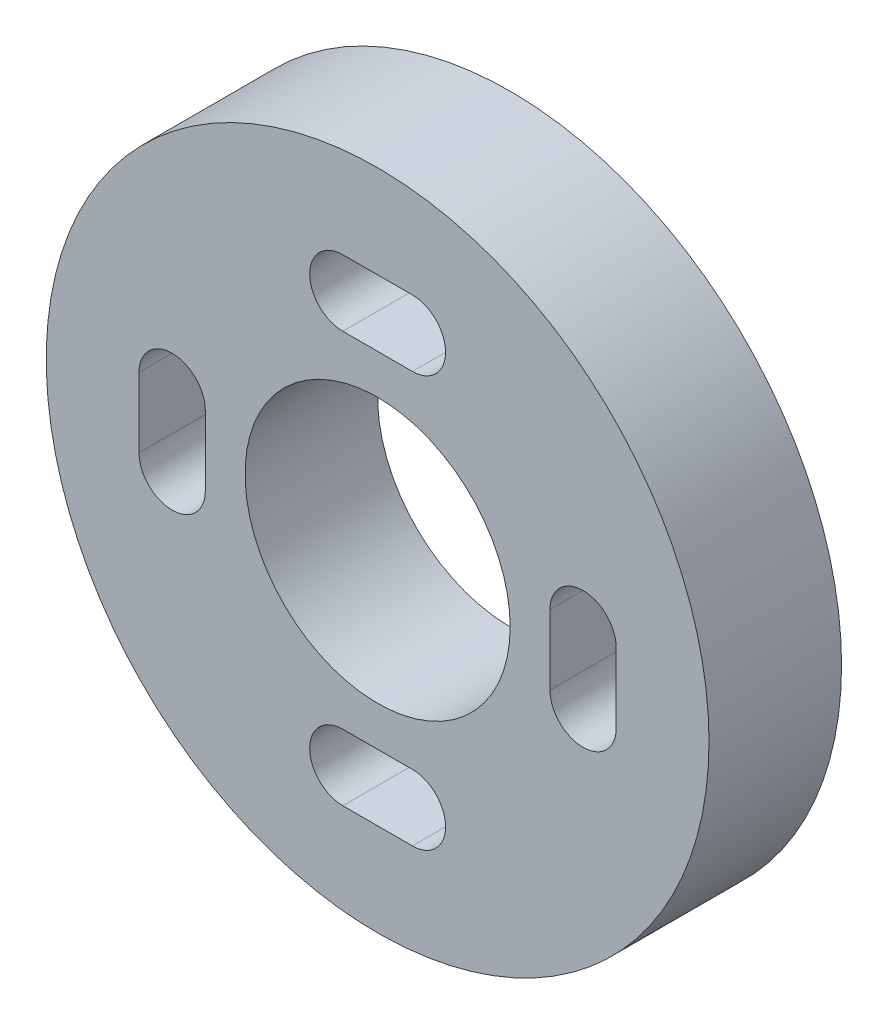
ISO-10303-21;
HEADER;
FILE_DESCRIPTION(('STEP AP214'),'2;1');
FILE_NAME('part.step','',(''),(''),'','','');
FILE_SCHEMA(('AUTOMOTIVE_DESIGN { 1 0 10303 214 1 1 1 1 }'));
ENDSEC;
DATA;
#1=APPLICATION_CONTEXT('core data for automotive mechanical design processes');
#2=APPLICATION_PROTOCOL_DEFINITION('international standard','automotive_design',2000,#1);
#3=PRODUCT_CONTEXT('',#1,'mechanical');
#4=PRODUCT('Part','Part','',(#3));
#5=PRODUCT_RELATED_PRODUCT_CATEGORY('part','',(#4));
#6=PRODUCT_DEFINITION_FORMATION('','',#4);
#7=PRODUCT_DEFINITION_CONTEXT('part definition',#1,'design');
#8=PRODUCT_DEFINITION('design','',#6,#7);
#9=PRODUCT_DEFINITION_SHAPE('','',#8);
#10=(LENGTH_UNIT() NAMED_UNIT(*) SI_UNIT(.MILLI.,.METRE.));
#11=(NAMED_UNIT(*) PLANE_ANGLE_UNIT() SI_UNIT($,.RADIAN.));
#12=(NAMED_UNIT(*) SI_UNIT($,.STERADIAN.) SOLID_ANGLE_UNIT());
#13=UNCERTAINTY_MEASURE_WITH_UNIT(LENGTH_MEASURE(1.E-05),#10,'distance_accuracy_value','');
#14=(GEOMETRIC_REPRESENTATION_CONTEXT(3) GLOBAL_UNCERTAINTY_ASSIGNED_CONTEXT((#13)) GLOBAL_UNIT_ASSIGNED_CONTEXT((#10,
#11,#12)) REPRESENTATION_CONTEXT('',''));
#15=CARTESIAN_POINT('',(0.,0.,0.));
#16=DIRECTION('',(0.,0.,1.));
#17=DIRECTION('',(1.,0.,0.));
#18=AXIS2_PLACEMENT_3D('',#15,#16,#17);
#19=CARTESIAN_POINT('',(0.,0.,4.));
#20=DIRECTION('',(0.,0.,-1.));
#21=DIRECTION('',(-1.,0.,0.));
#22=AXIS2_PLACEMENT_3D('',#19,#20,#21);
#23=CYLINDRICAL_SURFACE('',#22,10.);
#24=CARTESIAN_POINT('',(0.,0.,4.));
#25=DIRECTION('',(0.,0.,1.));
#26=DIRECTION('',(1.,0.,0.));
#27=AXIS2_PLACEMENT_3D('',#24,#25,#26);
#28=CIRCLE('',#27,10.);
#29=CARTESIAN_POINT('',(10.,0.,4.));
#30=VERTEX_POINT('',#29);
#31=EDGE_CURVE('E11',#30,#30,#28,.T.);
#32=ORIENTED_EDGE('',*,*,#31,.F.);
#33=EDGE_LOOP('',(#32));
#34=FACE_BOUND('',#33,.T.);
#35=CARTESIAN_POINT('',(0.,0.,0.));
#36=DIRECTION('',(0.,0.,1.));
#37=DIRECTION('',(1.,0.,0.));
#38=AXIS2_PLACEMENT_3D('',#35,#36,#37);
#39=CIRCLE('',#38,10.);
#40=CARTESIAN_POINT('',(10.,0.,0.));
#41=VERTEX_POINT('',#40);
#42=EDGE_CURVE('E41',#41,#41,#39,.T.);
#43=ORIENTED_EDGE('',*,*,#42,.T.);
#44=EDGE_LOOP('',(#43));
#45=FACE_BOUND('',#44,.T.);
#46=ADVANCED_FACE('F38',(#34,#45),#23,.T.);
#47=CARTESIAN_POINT('',(0.,0.,4.));
#48=DIRECTION('',(0.,0.,1.));
#49=DIRECTION('',(1.,0.,0.));
#50=AXIS2_PLACEMENT_3D('',#47,#48,#49);
#51=PLANE('',#50);
#52=DIRECTION('',(1.,0.,0.));
#53=VECTOR('',#52,1.);
#54=CARTESIAN_POINT('',(-1.05,5.2,4.));
#55=LINE('',#54,#53);
#56=CARTESIAN_POINT('',(-1.05,5.2,4.));
#57=VERTEX_POINT('',#56);
#58=CARTESIAN_POINT('',(1.05,5.2,4.));
#59=VERTEX_POINT('',#58);
#60=EDGE_CURVE('E253',#57,#59,#55,.T.);
#61=ORIENTED_EDGE('',*,*,#60,.F.);
#62=CARTESIAN_POINT('',(-1.05,6.2,4.));
#63=DIRECTION('',(0.,0.,1.));
#64=DIRECTION('',(1.,0.,0.));
#65=AXIS2_PLACEMENT_3D('',#62,#63,#64);
#66=CIRCLE('',#65,1.);
#67=CARTESIAN_POINT('',(-1.05,7.2,4.));
#68=VERTEX_POINT('',#67);
#69=EDGE_CURVE('E250',#68,#57,#66,.T.);
#70=ORIENTED_EDGE('',*,*,#69,.F.);
#71=DIRECTION('',(-1.,0.,0.));
#72=VECTOR('',#71,1.);
#73=CARTESIAN_POINT('',(-1.05,7.2,4.));
#74=LINE('',#73,#72);
#75=CARTESIAN_POINT('',(1.05,7.2,4.));
#76=VERTEX_POINT('',#75);
#77=EDGE_CURVE('E260',#76,#68,#74,.T.);
#78=ORIENTED_EDGE('',*,*,#77,.F.);
#79=CARTESIAN_POINT('',(1.05,6.2,4.));
#80=DIRECTION('',(0.,0.,1.));
#81=DIRECTION('',(1.,0.,0.));
#82=AXIS2_PLACEMENT_3D('',#79,#80,#81);
#83=CIRCLE('',#82,1.);
#84=EDGE_CURVE('E257',#59,#76,#83,.T.);
#85=ORIENTED_EDGE('',*,*,#84,.F.);
#86=EDGE_LOOP('',(#61,#70,#78,#85));
#87=FACE_BOUND('',#86,.T.);
#88=DIRECTION('',(0.,-1.,0.));
#89=VECTOR('',#88,1.);
#90=CARTESIAN_POINT('',(-7.2,1.05,4.));
#91=LINE('',#90,#89);
#92=CARTESIAN_POINT('',(-7.2,1.05,4.));
#93=VERTEX_POINT('',#92);
#94=CARTESIAN_POINT('',(-7.2,-1.05,4.));
#95=VERTEX_POINT('',#94);
#96=EDGE_CURVE('E296',#93,#95,#91,.T.);
#97=ORIENTED_EDGE('',*,*,#96,.F.);
#98=CARTESIAN_POINT('',(-6.2,1.05,4.));
#99=DIRECTION('',(0.,0.,1.));
#100=DIRECTION('',(1.,0.,0.));
#101=AXIS2_PLACEMENT_3D('',#98,#99,#100);
#102=CIRCLE('',#101,1.);
#103=CARTESIAN_POINT('',(-5.2,1.05,4.));
#104=VERTEX_POINT('',#103);
#105=EDGE_CURVE('E293',#104,#93,#102,.T.);
#106=ORIENTED_EDGE('',*,*,#105,.F.);
#107=DIRECTION('',(0.,1.,0.));
#108=VECTOR('',#107,1.);
#109=CARTESIAN_POINT('',(-5.2,1.05,4.));
#110=LINE('',#109,#108);
#111=CARTESIAN_POINT('',(-5.2,-1.05,4.));
#112=VERTEX_POINT('',#111);
#113=EDGE_CURVE('E303',#112,#104,#110,.T.);
#114=ORIENTED_EDGE('',*,*,#113,.F.);
#115=CARTESIAN_POINT('',(-6.2,-1.05,4.));
#116=DIRECTION('',(0.,0.,1.));
#117=DIRECTION('',(1.,0.,0.));
#118=AXIS2_PLACEMENT_3D('',#115,#116,#117);
#119=CIRCLE('',#118,1.);
#120=EDGE_CURVE('E300',#95,#112,#119,.T.);
#121=ORIENTED_EDGE('',*,*,#120,.F.);
#122=EDGE_LOOP('',(#97,#106,#114,#121));
#123=FACE_BOUND('',#122,.T.);
#124=DIRECTION('',(0.,-1.,0.));
#125=VECTOR('',#124,1.);
#126=CARTESIAN_POINT('',(5.2,1.05,4.));
#127=LINE('',#126,#125);
#128=CARTESIAN_POINT('',(5.2,1.05,4.));
#129=VERTEX_POINT('',#128);
#130=CARTESIAN_POINT('',(5.2,-1.05,4.));
#131=VERTEX_POINT('',#130);
#132=EDGE_CURVE('E163',#129,#131,#127,.T.);
#133=ORIENTED_EDGE('',*,*,#132,.F.);
#134=CARTESIAN_POINT('',(6.2,1.05,4.));
#135=DIRECTION('',(0.,0.,1.));
#136=DIRECTION('',(-1.,0.,0.));
#137=AXIS2_PLACEMENT_3D('',#134,#135,#136);
#138=CIRCLE('',#137,1.);
#139=CARTESIAN_POINT('',(7.2,1.05,4.));
#140=VERTEX_POINT('',#139);
#141=EDGE_CURVE('E152',#140,#129,#138,.T.);
#142=ORIENTED_EDGE('',*,*,#141,.F.);
#143=DIRECTION('',(0.,1.,0.));
#144=VECTOR('',#143,1.);
#145=CARTESIAN_POINT('',(7.2,1.05,4.));
#146=LINE('',#145,#144);
#147=CARTESIAN_POINT('',(7.2,-1.05,4.));
#148=VERTEX_POINT('',#147);
#149=EDGE_CURVE('E183',#148,#140,#146,.T.);
#150=ORIENTED_EDGE('',*,*,#149,.F.);
#151=CARTESIAN_POINT('',(6.2,-1.05,4.));
#152=DIRECTION('',(0.,0.,1.));
#153=DIRECTION('',(-1.,0.,0.));
#154=AXIS2_PLACEMENT_3D('',#151,#152,#153);
#155=CIRCLE('',#154,1.);
#156=EDGE_CURVE('E179',#131,#148,#155,.T.);
#157=ORIENTED_EDGE('',*,*,#156,.F.);
#158=EDGE_LOOP('',(#133,#142,#150,#157));
#159=FACE_BOUND('',#158,.T.);
#160=DIRECTION('',(1.,0.,0.));
#161=VECTOR('',#160,1.);
#162=CARTESIAN_POINT('',(-1.05,-7.2,4.));
#163=LINE('',#162,#161);
#164=CARTESIAN_POINT('',(-1.05,-7.2,4.));
#165=VERTEX_POINT('',#164);
#166=CARTESIAN_POINT('',(1.05,-7.2,4.));
#167=VERTEX_POINT('',#166);
#168=EDGE_CURVE('E211',#165,#167,#163,.T.);
#169=ORIENTED_EDGE('',*,*,#168,.F.);
#170=CARTESIAN_POINT('',(-1.05,-6.2,4.));
#171=DIRECTION('',(0.,0.,1.));
#172=DIRECTION('',(-1.,0.,0.));
#173=AXIS2_PLACEMENT_3D('',#170,#171,#172);
#174=CIRCLE('',#173,1.);
#175=CARTESIAN_POINT('',(-1.05,-5.2,4.));
#176=VERTEX_POINT('',#175);
#177=EDGE_CURVE('E208',#176,#165,#174,.T.);
#178=ORIENTED_EDGE('',*,*,#177,.F.);
#179=DIRECTION('',(-1.,0.,0.));
#180=VECTOR('',#179,1.);
#181=CARTESIAN_POINT('',(-1.05,-5.2,4.));
#182=LINE('',#181,#180);
#183=CARTESIAN_POINT('',(1.05,-5.2,4.));
#184=VERTEX_POINT('',#183);
#185=EDGE_CURVE('E219',#184,#176,#182,.T.);
#186=ORIENTED_EDGE('',*,*,#185,.F.);
#187=CARTESIAN_POINT('',(1.05,-6.2,4.));
#188=DIRECTION('',(0.,0.,1.));
#189=DIRECTION('',(-1.,0.,0.));
#190=AXIS2_PLACEMENT_3D('',#187,#188,#189);
#191=CIRCLE('',#190,1.);
#192=EDGE_CURVE('E215',#167,#184,#191,.T.);
#193=ORIENTED_EDGE('',*,*,#192,.F.);
#194=EDGE_LOOP('',(#169,#178,#186,#193));
#195=FACE_BOUND('',#194,.T.);
#196=CARTESIAN_POINT('',(0.,0.,4.));
#197=DIRECTION('',(0.,0.,1.));
#198=DIRECTION('',(1.,0.,0.));
#199=AXIS2_PLACEMENT_3D('',#196,#197,#198);
#200=CIRCLE('',#199,4.);
#201=CARTESIAN_POINT('',(4.,0.,4.));
#202=VERTEX_POINT('',#201);
#203=EDGE_CURVE('E332',#202,#202,#200,.T.);
#204=ORIENTED_EDGE('',*,*,#203,.F.);
#205=EDGE_LOOP('',(#204));
#206=FACE_BOUND('',#205,.T.);
#207=ORIENTED_EDGE('',*,*,#31,.T.);
#208=EDGE_LOOP('',(#207));
#209=FACE_BOUND('',#208,.T.);
#210=ADVANCED_FACE('F176',(#87,#123,#159,#195,#206,#209),#51,.T.);
#211=CARTESIAN_POINT('',(0.,0.,0.));
#212=DIRECTION('',(0.,0.,1.));
#213=DIRECTION('',(1.,0.,0.));
#214=AXIS2_PLACEMENT_3D('',#211,#212,#213);
#215=PLANE('',#214);
#216=CARTESIAN_POINT('',(-1.05,6.2,0.));
#217=DIRECTION('',(0.,0.,1.));
#218=DIRECTION('',(1.,0.,0.));
#219=AXIS2_PLACEMENT_3D('',#216,#217,#218);
#220=CIRCLE('',#219,1.);
#221=CARTESIAN_POINT('',(-1.05,7.2,0.));
#222=VERTEX_POINT('',#221);
#223=CARTESIAN_POINT('',(-1.05,5.2,0.));
#224=VERTEX_POINT('',#223);
#225=EDGE_CURVE('E264',#222,#224,#220,.T.);
#226=ORIENTED_EDGE('',*,*,#225,.T.);
#227=DIRECTION('',(1.,0.,0.));
#228=VECTOR('',#227,1.);
#229=CARTESIAN_POINT('',(-1.05,5.2,0.));
#230=LINE('',#229,#228);
#231=CARTESIAN_POINT('',(1.05,5.2,0.));
#232=VERTEX_POINT('',#231);
#233=EDGE_CURVE('E268',#224,#232,#230,.T.);
#234=ORIENTED_EDGE('',*,*,#233,.T.);
#235=CARTESIAN_POINT('',(1.05,6.2,0.));
#236=DIRECTION('',(0.,0.,1.));
#237=DIRECTION('',(1.,0.,0.));
#238=AXIS2_PLACEMENT_3D('',#235,#236,#237);
#239=CIRCLE('',#238,1.);
#240=CARTESIAN_POINT('',(1.05,7.2,0.));
#241=VERTEX_POINT('',#240);
#242=EDGE_CURVE('E273',#232,#241,#239,.T.);
#243=ORIENTED_EDGE('',*,*,#242,.T.);
#244=DIRECTION('',(-1.,0.,0.));
#245=VECTOR('',#244,1.);
#246=CARTESIAN_POINT('',(-1.05,7.2,0.));
#247=LINE('',#246,#245);
#248=EDGE_CURVE('E254',#241,#222,#247,.T.);
#249=ORIENTED_EDGE('',*,*,#248,.T.);
#250=EDGE_LOOP('',(#226,#234,#243,#249));
#251=FACE_BOUND('',#250,.T.);
#252=CARTESIAN_POINT('',(-6.2,1.05,0.));
#253=DIRECTION('',(0.,0.,1.));
#254=DIRECTION('',(1.,0.,0.));
#255=AXIS2_PLACEMENT_3D('',#252,#253,#254);
#256=CIRCLE('',#255,1.);
#257=CARTESIAN_POINT('',(-5.2,1.05,0.));
#258=VERTEX_POINT('',#257);
#259=CARTESIAN_POINT('',(-7.2,1.05,0.));
#260=VERTEX_POINT('',#259);
#261=EDGE_CURVE('E172',#258,#260,#256,.T.);
#262=ORIENTED_EDGE('',*,*,#261,.T.);
#263=DIRECTION('',(0.,-1.,0.));
#264=VECTOR('',#263,1.);
#265=CARTESIAN_POINT('',(-7.2,1.05,0.));
#266=LINE('',#265,#264);
#267=CARTESIAN_POINT('',(-7.2,-1.05,0.));
#268=VERTEX_POINT('',#267);
#269=EDGE_CURVE('E310',#260,#268,#266,.T.);
#270=ORIENTED_EDGE('',*,*,#269,.T.);
#271=CARTESIAN_POINT('',(-6.2,-1.05,0.));
#272=DIRECTION('',(0.,0.,1.));
#273=DIRECTION('',(1.,0.,0.));
#274=AXIS2_PLACEMENT_3D('',#271,#272,#273);
#275=CIRCLE('',#274,1.);
#276=CARTESIAN_POINT('',(-5.2,-1.05,0.));
#277=VERTEX_POINT('',#276);
#278=EDGE_CURVE('E314',#268,#277,#275,.T.);
#279=ORIENTED_EDGE('',*,*,#278,.T.);
#280=DIRECTION('',(0.,1.,0.));
#281=VECTOR('',#280,1.);
#282=CARTESIAN_POINT('',(-5.2,1.05,0.));
#283=LINE('',#282,#281);
#284=EDGE_CURVE('E297',#277,#258,#283,.T.);
#285=ORIENTED_EDGE('',*,*,#284,.T.);
#286=EDGE_LOOP('',(#262,#270,#279,#285));
#287=FACE_BOUND('',#286,.T.);
#288=CARTESIAN_POINT('',(6.2,1.05,0.));
#289=DIRECTION('',(0.,0.,1.));
#290=DIRECTION('',(-1.,0.,0.));
#291=AXIS2_PLACEMENT_3D('',#288,#289,#290);
#292=CIRCLE('',#291,1.);
#293=CARTESIAN_POINT('',(7.2,1.05,0.));
#294=VERTEX_POINT('',#293);
#295=CARTESIAN_POINT('',(5.2,1.05,0.));
#296=VERTEX_POINT('',#295);
#297=EDGE_CURVE('E188',#294,#296,#292,.T.);
#298=ORIENTED_EDGE('',*,*,#297,.T.);
#299=DIRECTION('',(0.,-1.,0.));
#300=VECTOR('',#299,1.);
#301=CARTESIAN_POINT('',(5.2,1.05,0.));
#302=LINE('',#301,#300);
#303=CARTESIAN_POINT('',(5.2,-1.05,0.));
#304=VERTEX_POINT('',#303);
#305=EDGE_CURVE('E170',#296,#304,#302,.T.);
#306=ORIENTED_EDGE('',*,*,#305,.T.);
#307=CARTESIAN_POINT('',(6.2,-1.05,0.));
#308=DIRECTION('',(0.,0.,1.));
#309=DIRECTION('',(-1.,0.,0.));
#310=AXIS2_PLACEMENT_3D('',#307,#308,#309);
#311=CIRCLE('',#310,1.);
#312=CARTESIAN_POINT('',(7.2,-1.05,0.));
#313=VERTEX_POINT('',#312);
#314=EDGE_CURVE('E194',#304,#313,#311,.T.);
#315=ORIENTED_EDGE('',*,*,#314,.T.);
#316=DIRECTION('',(0.,1.,0.));
#317=VECTOR('',#316,1.);
#318=CARTESIAN_POINT('',(7.2,1.05,0.));
#319=LINE('',#318,#317);
#320=EDGE_CURVE('E164',#313,#294,#319,.T.);
#321=ORIENTED_EDGE('',*,*,#320,.T.);
#322=EDGE_LOOP('',(#298,#306,#315,#321));
#323=FACE_BOUND('',#322,.T.);
#324=CARTESIAN_POINT('',(-1.05,-6.2,0.));
#325=DIRECTION('',(0.,0.,1.));
#326=DIRECTION('',(-1.,0.,0.));
#327=AXIS2_PLACEMENT_3D('',#324,#325,#326);
#328=CIRCLE('',#327,1.);
#329=CARTESIAN_POINT('',(-1.05,-5.2,0.));
#330=VERTEX_POINT('',#329);
#331=CARTESIAN_POINT('',(-1.05,-7.2,0.));
#332=VERTEX_POINT('',#331);
#333=EDGE_CURVE('E223',#330,#332,#328,.T.);
#334=ORIENTED_EDGE('',*,*,#333,.T.);
#335=DIRECTION('',(1.,0.,0.));
#336=VECTOR('',#335,1.);
#337=CARTESIAN_POINT('',(-1.05,-7.2,0.));
#338=LINE('',#337,#336);
#339=CARTESIAN_POINT('',(1.05,-7.2,0.));
#340=VERTEX_POINT('',#339);
#341=EDGE_CURVE('E227',#332,#340,#338,.T.);
#342=ORIENTED_EDGE('',*,*,#341,.T.);
#343=CARTESIAN_POINT('',(1.05,-6.2,0.));
#344=DIRECTION('',(0.,0.,1.));
#345=DIRECTION('',(-1.,0.,0.));
#346=AXIS2_PLACEMENT_3D('',#343,#344,#345);
#347=CIRCLE('',#346,1.);
#348=CARTESIAN_POINT('',(1.05,-5.2,0.));
#349=VERTEX_POINT('',#348);
#350=EDGE_CURVE('E231',#340,#349,#347,.T.);
#351=ORIENTED_EDGE('',*,*,#350,.T.);
#352=DIRECTION('',(-1.,0.,0.));
#353=VECTOR('',#352,1.);
#354=CARTESIAN_POINT('',(-1.05,-5.2,0.));
#355=LINE('',#354,#353);
#356=EDGE_CURVE('E212',#349,#330,#355,.T.);
#357=ORIENTED_EDGE('',*,*,#356,.T.);
#358=EDGE_LOOP('',(#334,#342,#351,#357));
#359=FACE_BOUND('',#358,.T.);
#360=CARTESIAN_POINT('',(0.,0.,0.));
#361=DIRECTION('',(0.,0.,1.));
#362=DIRECTION('',(1.,0.,0.));
#363=AXIS2_PLACEMENT_3D('',#360,#361,#362);
#364=CIRCLE('',#363,4.);
#365=CARTESIAN_POINT('',(4.,0.,0.));
#366=VERTEX_POINT('',#365);
#367=EDGE_CURVE('E292',#366,#366,#364,.T.);
#368=ORIENTED_EDGE('',*,*,#367,.T.);
#369=EDGE_LOOP('',(#368));
#370=FACE_BOUND('',#369,.T.);
#371=ORIENTED_EDGE('',*,*,#42,.F.);
#372=EDGE_LOOP('',(#371));
#373=FACE_BOUND('',#372,.T.);
#374=ADVANCED_FACE('F340',(#251,#287,#323,#359,#370,#373),#215,.F.);
#375=CARTESIAN_POINT('',(0.,0.,4.));
#376=DIRECTION('',(0.,0.,-1.));
#377=DIRECTION('',(-1.,0.,0.));
#378=AXIS2_PLACEMENT_3D('',#375,#376,#377);
#379=CYLINDRICAL_SURFACE('',#378,4.);
#380=ORIENTED_EDGE('',*,*,#203,.T.);
#381=EDGE_LOOP('',(#380));
#382=FACE_BOUND('',#381,.T.);
#383=ORIENTED_EDGE('',*,*,#367,.F.);
#384=EDGE_LOOP('',(#383));
#385=FACE_BOUND('',#384,.T.);
#386=ADVANCED_FACE('F343',(#382,#385),#379,.F.);
#387=CARTESIAN_POINT('',(-1.05,-6.2,4.));
#388=DIRECTION('',(0.,0.,-1.));
#389=DIRECTION('',(-1.,0.,0.));
#390=AXIS2_PLACEMENT_3D('',#387,#388,#389);
#391=CYLINDRICAL_SURFACE('',#390,1.);
#392=ORIENTED_EDGE('',*,*,#333,.F.);
#393=DIRECTION('',(0.,0.,-1.));
#394=VECTOR('',#393,1.);
#395=CARTESIAN_POINT('',(-1.05,-5.2,4.));
#396=LINE('',#395,#394);
#397=EDGE_CURVE('E222',#176,#330,#396,.T.);
#398=ORIENTED_EDGE('',*,*,#397,.F.);
#399=ORIENTED_EDGE('',*,*,#177,.T.);
#400=DIRECTION('',(0.,0.,-1.));
#401=VECTOR('',#400,1.);
#402=CARTESIAN_POINT('',(-1.05,-7.2,4.));
#403=LINE('',#402,#401);
#404=EDGE_CURVE('E191',#165,#332,#403,.T.);
#405=ORIENTED_EDGE('',*,*,#404,.T.);
#406=EDGE_LOOP('',(#392,#398,#399,#405));
#407=FACE_BOUND('',#406,.T.);
#408=ADVANCED_FACE('F345',(#407),#391,.F.);
#409=CARTESIAN_POINT('',(-1.05,-7.2,4.));
#410=DIRECTION('',(0.,1.,0.));
#411=DIRECTION('',(0.,0.,1.));
#412=AXIS2_PLACEMENT_3D('',#409,#410,#411);
#413=PLANE('',#412);
#414=ORIENTED_EDGE('',*,*,#341,.F.);
#415=ORIENTED_EDGE('',*,*,#404,.F.);
#416=ORIENTED_EDGE('',*,*,#168,.T.);
#417=DIRECTION('',(0.,0.,-1.));
#418=VECTOR('',#417,1.);
#419=CARTESIAN_POINT('',(1.05,-7.2,4.));
#420=LINE('',#419,#418);
#421=EDGE_CURVE('E244',#167,#340,#420,.T.);
#422=ORIENTED_EDGE('',*,*,#421,.T.);
#423=EDGE_LOOP('',(#414,#415,#416,#422));
#424=FACE_BOUND('',#423,.T.);
#425=ADVANCED_FACE('F352',(#424),#413,.T.);
#426=CARTESIAN_POINT('',(1.05,-6.2,4.));
#427=DIRECTION('',(0.,0.,-1.));
#428=DIRECTION('',(-1.,0.,0.));
#429=AXIS2_PLACEMENT_3D('',#426,#427,#428);
#430=CYLINDRICAL_SURFACE('',#429,1.);
#431=ORIENTED_EDGE('',*,*,#350,.F.);
#432=ORIENTED_EDGE('',*,*,#421,.F.);
#433=ORIENTED_EDGE('',*,*,#192,.T.);
#434=DIRECTION('',(0.,0.,-1.));
#435=VECTOR('',#434,1.);
#436=CARTESIAN_POINT('',(1.05,-5.2,4.));
#437=LINE('',#436,#435);
#438=EDGE_CURVE('E241',#184,#349,#437,.T.);
#439=ORIENTED_EDGE('',*,*,#438,.T.);
#440=EDGE_LOOP('',(#431,#432,#433,#439));
#441=FACE_BOUND('',#440,.T.);
#442=ADVANCED_FACE('F430',(#441),#430,.F.);
#443=CARTESIAN_POINT('',(-1.05,-5.2,4.));
#444=DIRECTION('',(0.,-1.,0.));
#445=DIRECTION('',(0.,0.,-1.));
#446=AXIS2_PLACEMENT_3D('',#443,#444,#445);
#447=PLANE('',#446);
#448=ORIENTED_EDGE('',*,*,#356,.F.);
#449=ORIENTED_EDGE('',*,*,#438,.F.);
#450=ORIENTED_EDGE('',*,*,#185,.T.);
#451=ORIENTED_EDGE('',*,*,#397,.T.);
#452=EDGE_LOOP('',(#448,#449,#450,#451));
#453=FACE_BOUND('',#452,.T.);
#454=ADVANCED_FACE('F427',(#453),#447,.T.);
#455=CARTESIAN_POINT('',(6.2,1.05,4.));
#456=DIRECTION('',(0.,0.,-1.));
#457=DIRECTION('',(-1.,0.,0.));
#458=AXIS2_PLACEMENT_3D('',#455,#456,#457);
#459=CYLINDRICAL_SURFACE('',#458,1.);
#460=ORIENTED_EDGE('',*,*,#297,.F.);
#461=DIRECTION('',(0.,0.,-1.));
#462=VECTOR('',#461,1.);
#463=CARTESIAN_POINT('',(7.2,1.05,4.));
#464=LINE('',#463,#462);
#465=EDGE_CURVE('E158',#140,#294,#464,.T.);
#466=ORIENTED_EDGE('',*,*,#465,.F.);
#467=ORIENTED_EDGE('',*,*,#141,.T.);
#468=DIRECTION('',(0.,0.,-1.));
#469=VECTOR('',#468,1.);
#470=CARTESIAN_POINT('',(5.2,1.05,4.));
#471=LINE('',#470,#469);
#472=EDGE_CURVE('E155',#129,#296,#471,.T.);
#473=ORIENTED_EDGE('',*,*,#472,.T.);
#474=EDGE_LOOP('',(#460,#466,#467,#473));
#475=FACE_BOUND('',#474,.T.);
#476=ADVANCED_FACE('F154',(#475),#459,.F.);
#477=CARTESIAN_POINT('',(5.2,1.05,4.));
#478=DIRECTION('',(1.,0.,0.));
#479=DIRECTION('',(0.,1.,0.));
#480=AXIS2_PLACEMENT_3D('',#477,#478,#479);
#481=PLANE('',#480);
#482=ORIENTED_EDGE('',*,*,#305,.F.);
#483=ORIENTED_EDGE('',*,*,#472,.F.);
#484=ORIENTED_EDGE('',*,*,#132,.T.);
#485=DIRECTION('',(0.,0.,-1.));
#486=VECTOR('',#485,1.);
#487=CARTESIAN_POINT('',(5.2,-1.05,4.));
#488=LINE('',#487,#486);
#489=EDGE_CURVE('E173',#131,#304,#488,.T.);
#490=ORIENTED_EDGE('',*,*,#489,.T.);
#491=EDGE_LOOP('',(#482,#483,#484,#490));
#492=FACE_BOUND('',#491,.T.);
#493=ADVANCED_FACE('F167',(#492),#481,.T.);
#494=CARTESIAN_POINT('',(6.2,-1.05,4.));
#495=DIRECTION('',(0.,0.,-1.));
#496=DIRECTION('',(-1.,0.,0.));
#497=AXIS2_PLACEMENT_3D('',#494,#495,#496);
#498=CYLINDRICAL_SURFACE('',#497,1.);
#499=ORIENTED_EDGE('',*,*,#314,.F.);
#500=ORIENTED_EDGE('',*,*,#489,.F.);
#501=ORIENTED_EDGE('',*,*,#156,.T.);
#502=DIRECTION('',(0.,0.,-1.));
#503=VECTOR('',#502,1.);
#504=CARTESIAN_POINT('',(7.2,-1.05,4.));
#505=LINE('',#504,#503);
#506=EDGE_CURVE('E203',#148,#313,#505,.T.);
#507=ORIENTED_EDGE('',*,*,#506,.T.);
#508=EDGE_LOOP('',(#499,#500,#501,#507));
#509=FACE_BOUND('',#508,.T.);
#510=ADVANCED_FACE('F413',(#509),#498,.F.);
#511=CARTESIAN_POINT('',(7.2,1.05,4.));
#512=DIRECTION('',(-1.,0.,0.));
#513=DIRECTION('',(0.,-1.,0.));
#514=AXIS2_PLACEMENT_3D('',#511,#512,#513);
#515=PLANE('',#514);
#516=ORIENTED_EDGE('',*,*,#320,.F.);
#517=ORIENTED_EDGE('',*,*,#506,.F.);
#518=ORIENTED_EDGE('',*,*,#149,.T.);
#519=ORIENTED_EDGE('',*,*,#465,.T.);
#520=EDGE_LOOP('',(#516,#517,#518,#519));
#521=FACE_BOUND('',#520,.T.);
#522=ADVANCED_FACE('F409',(#521),#515,.T.);
#523=CARTESIAN_POINT('',(-6.2,1.05,4.));
#524=DIRECTION('',(0.,0.,-1.));
#525=DIRECTION('',(-1.,0.,0.));
#526=AXIS2_PLACEMENT_3D('',#523,#524,#525);
#527=CYLINDRICAL_SURFACE('',#526,1.);
#528=ORIENTED_EDGE('',*,*,#261,.F.);
#529=DIRECTION('',(0.,0.,-1.));
#530=VECTOR('',#529,1.);
#531=CARTESIAN_POINT('',(-5.2,1.05,4.));
#532=LINE('',#531,#530);
#533=EDGE_CURVE('E306',#104,#258,#532,.T.);
#534=ORIENTED_EDGE('',*,*,#533,.F.);
#535=ORIENTED_EDGE('',*,*,#105,.T.);
#536=DIRECTION('',(0.,0.,-1.));
#537=VECTOR('',#536,1.);
#538=CARTESIAN_POINT('',(-7.2,1.05,4.));
#539=LINE('',#538,#537);
#540=EDGE_CURVE('E269',#93,#260,#539,.T.);
#541=ORIENTED_EDGE('',*,*,#540,.T.);
#542=EDGE_LOOP('',(#528,#534,#535,#541));
#543=FACE_BOUND('',#542,.T.);
#544=ADVANCED_FACE('F391',(#543),#527,.F.);
#545=CARTESIAN_POINT('',(-7.2,1.05,4.));
#546=DIRECTION('',(1.,0.,0.));
#547=DIRECTION('',(0.,1.,0.));
#548=AXIS2_PLACEMENT_3D('',#545,#546,#547);
#549=PLANE('',#548);
#550=ORIENTED_EDGE('',*,*,#269,.F.);
#551=ORIENTED_EDGE('',*,*,#540,.F.);
#552=ORIENTED_EDGE('',*,*,#96,.T.);
#553=DIRECTION('',(0.,0.,-1.));
#554=VECTOR('',#553,1.);
#555=CARTESIAN_POINT('',(-7.2,-1.05,4.));
#556=LINE('',#555,#554);
#557=EDGE_CURVE('E326',#95,#268,#556,.T.);
#558=ORIENTED_EDGE('',*,*,#557,.T.);
#559=EDGE_LOOP('',(#550,#551,#552,#558));
#560=FACE_BOUND('',#559,.T.);
#561=ADVANCED_FACE('F384',(#560),#549,.T.);
#562=CARTESIAN_POINT('',(-6.2,-1.05,4.));
#563=DIRECTION('',(0.,0.,-1.));
#564=DIRECTION('',(-1.,0.,0.));
#565=AXIS2_PLACEMENT_3D('',#562,#563,#564);
#566=CYLINDRICAL_SURFACE('',#565,1.);
#567=ORIENTED_EDGE('',*,*,#278,.F.);
#568=ORIENTED_EDGE('',*,*,#557,.F.);
#569=ORIENTED_EDGE('',*,*,#120,.T.);
#570=DIRECTION('',(0.,0.,-1.));
#571=VECTOR('',#570,1.);
#572=CARTESIAN_POINT('',(-5.2,-1.05,4.));
#573=LINE('',#572,#571);
#574=EDGE_CURVE('E61',#112,#277,#573,.T.);
#575=ORIENTED_EDGE('',*,*,#574,.T.);
#576=EDGE_LOOP('',(#567,#568,#569,#575));
#577=FACE_BOUND('',#576,.T.);
#578=ADVANCED_FACE('F387',(#577),#566,.F.);
#579=CARTESIAN_POINT('',(-5.2,1.05,4.));
#580=DIRECTION('',(-1.,0.,0.));
#581=DIRECTION('',(0.,-1.,0.));
#582=AXIS2_PLACEMENT_3D('',#579,#580,#581);
#583=PLANE('',#582);
#584=ORIENTED_EDGE('',*,*,#284,.F.);
#585=ORIENTED_EDGE('',*,*,#574,.F.);
#586=ORIENTED_EDGE('',*,*,#113,.T.);
#587=ORIENTED_EDGE('',*,*,#533,.T.);
#588=EDGE_LOOP('',(#584,#585,#586,#587));
#589=FACE_BOUND('',#588,.T.);
#590=ADVANCED_FACE('F393',(#589),#583,.T.);
#591=CARTESIAN_POINT('',(-1.05,6.2,4.));
#592=DIRECTION('',(0.,0.,-1.));
#593=DIRECTION('',(-1.,0.,0.));
#594=AXIS2_PLACEMENT_3D('',#591,#592,#593);
#595=CYLINDRICAL_SURFACE('',#594,1.);
#596=ORIENTED_EDGE('',*,*,#225,.F.);
#597=DIRECTION('',(0.,0.,-1.));
#598=VECTOR('',#597,1.);
#599=CARTESIAN_POINT('',(-1.05,7.2,4.));
#600=LINE('',#599,#598);
#601=EDGE_CURVE('E263',#68,#222,#600,.T.);
#602=ORIENTED_EDGE('',*,*,#601,.F.);
#603=ORIENTED_EDGE('',*,*,#69,.T.);
#604=DIRECTION('',(0.,0.,-1.));
#605=VECTOR('',#604,1.);
#606=CARTESIAN_POINT('',(-1.05,5.2,4.));
#607=LINE('',#606,#605);
#608=EDGE_CURVE('E288',#57,#224,#607,.T.);
#609=ORIENTED_EDGE('',*,*,#608,.T.);
#610=EDGE_LOOP('',(#596,#602,#603,#609));
#611=FACE_BOUND('',#610,.T.);
#612=ADVANCED_FACE('F395',(#611),#595,.F.);
#613=CARTESIAN_POINT('',(-1.05,5.2,4.));
#614=DIRECTION('',(0.,1.,0.));
#615=DIRECTION('',(0.,0.,1.));
#616=AXIS2_PLACEMENT_3D('',#613,#614,#615);
#617=PLANE('',#616);
#618=ORIENTED_EDGE('',*,*,#233,.F.);
#619=ORIENTED_EDGE('',*,*,#608,.F.);
#620=ORIENTED_EDGE('',*,*,#60,.T.);
#621=DIRECTION('',(0.,0.,-1.));
#622=VECTOR('',#621,1.);
#623=CARTESIAN_POINT('',(1.05,5.2,4.));
#624=LINE('',#623,#622);
#625=EDGE_CURVE('E285',#59,#232,#624,.T.);
#626=ORIENTED_EDGE('',*,*,#625,.T.);
#627=EDGE_LOOP('',(#618,#619,#620,#626));
#628=FACE_BOUND('',#627,.T.);
#629=ADVANCED_FACE('F401',(#628),#617,.T.);
#630=CARTESIAN_POINT('',(1.05,6.2,4.));
#631=DIRECTION('',(0.,0.,-1.));
#632=DIRECTION('',(-1.,0.,0.));
#633=AXIS2_PLACEMENT_3D('',#630,#631,#632);
#634=CYLINDRICAL_SURFACE('',#633,1.);
#635=ORIENTED_EDGE('',*,*,#242,.F.);
#636=ORIENTED_EDGE('',*,*,#625,.F.);
#637=ORIENTED_EDGE('',*,*,#84,.T.);
#638=DIRECTION('',(0.,0.,-1.));
#639=VECTOR('',#638,1.);
#640=CARTESIAN_POINT('',(1.05,7.2,4.));
#641=LINE('',#640,#639);
#642=EDGE_CURVE('E53',#76,#241,#641,.T.);
#643=ORIENTED_EDGE('',*,*,#642,.T.);
#644=EDGE_LOOP('',(#635,#636,#637,#643));
#645=FACE_BOUND('',#644,.T.);
#646=ADVANCED_FACE('F441',(#645),#634,.F.);
#647=CARTESIAN_POINT('',(-1.05,7.2,4.));
#648=DIRECTION('',(0.,-1.,0.));
#649=DIRECTION('',(0.,0.,-1.));
#650=AXIS2_PLACEMENT_3D('',#647,#648,#649);
#651=PLANE('',#650);
#652=ORIENTED_EDGE('',*,*,#248,.F.);
#653=ORIENTED_EDGE('',*,*,#642,.F.);
#654=ORIENTED_EDGE('',*,*,#77,.T.);
#655=ORIENTED_EDGE('',*,*,#601,.T.);
#656=EDGE_LOOP('',(#652,#653,#654,#655));
#657=FACE_BOUND('',#656,.T.);
#658=ADVANCED_FACE('F438',(#657),#651,.T.);
#659=CLOSED_SHELL('',(#46,#210,#374,#386,#408,#425,#442,#454,#476,#493,#510,#522,#544,#561,#578,
#590,#612,#629,#646,#658));
#660=MANIFOLD_SOLID_BREP('B2',#659);
#661=ADVANCED_BREP_SHAPE_REPRESENTATION('',(#18,#660),#14);
#662=SHAPE_DEFINITION_REPRESENTATION(#9,#661);
ENDSEC;
END-ISO-10303-21;
